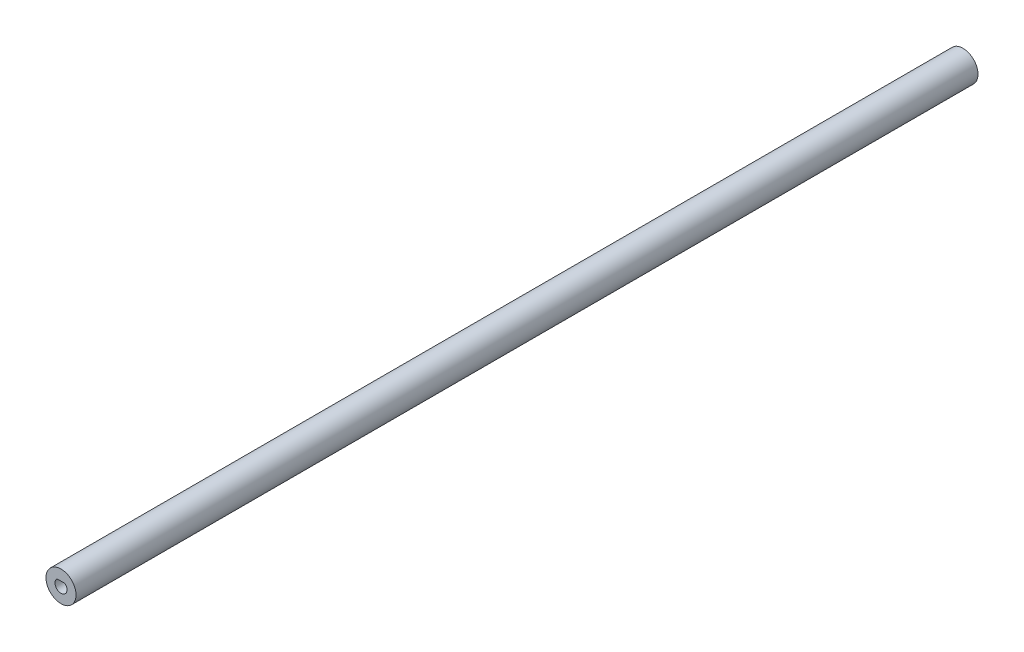
ISO-10303-21;
HEADER;
FILE_DESCRIPTION(('STEP AP214'),'2;1');
FILE_NAME('part.step','',(''),(''),'','','');
FILE_SCHEMA(('AUTOMOTIVE_DESIGN { 1 0 10303 214 1 1 1 1 }'));
ENDSEC;
DATA;
#1=APPLICATION_CONTEXT('core data for automotive mechanical design processes');
#2=APPLICATION_PROTOCOL_DEFINITION('international standard','automotive_design',2000,#1);
#3=PRODUCT_CONTEXT('',#1,'mechanical');
#4=PRODUCT('Part','Part','',(#3));
#5=PRODUCT_RELATED_PRODUCT_CATEGORY('part','',(#4));
#6=PRODUCT_DEFINITION_FORMATION('','',#4);
#7=PRODUCT_DEFINITION_CONTEXT('part definition',#1,'design');
#8=PRODUCT_DEFINITION('design','',#6,#7);
#9=PRODUCT_DEFINITION_SHAPE('','',#8);
#10=(LENGTH_UNIT() NAMED_UNIT(*) SI_UNIT(.MILLI.,.METRE.));
#11=(NAMED_UNIT(*) PLANE_ANGLE_UNIT() SI_UNIT($,.RADIAN.));
#12=(NAMED_UNIT(*) SI_UNIT($,.STERADIAN.) SOLID_ANGLE_UNIT());
#13=UNCERTAINTY_MEASURE_WITH_UNIT(LENGTH_MEASURE(1.E-05),#10,'distance_accuracy_value','');
#14=(GEOMETRIC_REPRESENTATION_CONTEXT(3) GLOBAL_UNCERTAINTY_ASSIGNED_CONTEXT((#13)) GLOBAL_UNIT_ASSIGNED_CONTEXT((#10,
#11,#12)) REPRESENTATION_CONTEXT('',''));
#15=CARTESIAN_POINT('',(0.,0.,0.));
#16=DIRECTION('',(0.,0.,1.));
#17=DIRECTION('',(1.,0.,0.));
#18=AXIS2_PLACEMENT_3D('',#15,#16,#17);
#19=CARTESIAN_POINT('',(-21.928145629141,1.41202452717339,300.));
#20=DIRECTION('',(0.,0.,-1.));
#21=DIRECTION('',(-1.,0.,0.));
#22=AXIS2_PLACEMENT_3D('',#19,#20,#21);
#23=CYLINDRICAL_SURFACE('',#22,5.);
#24=CARTESIAN_POINT('',(-21.928145629141,1.41202452717339,300.));
#25=DIRECTION('',(0.,0.,1.));
#26=DIRECTION('',(1.,0.,0.));
#27=AXIS2_PLACEMENT_3D('',#24,#25,#26);
#28=CIRCLE('',#27,5.);
#29=CARTESIAN_POINT('',(-16.928145629141,1.41202452717339,300.));
#30=VERTEX_POINT('',#29);
#31=EDGE_CURVE('E11',#30,#30,#28,.T.);
#32=ORIENTED_EDGE('',*,*,#31,.F.);
#33=EDGE_LOOP('',(#32));
#34=FACE_BOUND('',#33,.T.);
#35=CARTESIAN_POINT('',(-21.928145629141,1.41202452717339,0.));
#36=DIRECTION('',(0.,0.,1.));
#37=DIRECTION('',(1.,0.,0.));
#38=AXIS2_PLACEMENT_3D('',#35,#36,#37);
#39=CIRCLE('',#38,5.);
#40=CARTESIAN_POINT('',(-16.928145629141,1.41202452717339,0.));
#41=VERTEX_POINT('',#40);
#42=EDGE_CURVE('E41',#41,#41,#39,.T.);
#43=ORIENTED_EDGE('',*,*,#42,.T.);
#44=EDGE_LOOP('',(#43));
#45=FACE_BOUND('',#44,.T.);
#46=ADVANCED_FACE('F38',(#34,#45),#23,.T.);
#47=CARTESIAN_POINT('',(-21.928145629141,1.41202452717339,300.));
#48=DIRECTION('',(0.,0.,1.));
#49=DIRECTION('',(1.,0.,0.));
#50=AXIS2_PLACEMENT_3D('',#47,#48,#49);
#51=PLANE('',#50);
#52=CARTESIAN_POINT('',(-21.928145629141,1.41202452717339,300.));
#53=DIRECTION('',(0.,0.,1.));
#54=DIRECTION('',(1.,0.,0.));
#55=AXIS2_PLACEMENT_3D('',#52,#53,#54);
#56=CIRCLE('',#55,2.);
#57=CARTESIAN_POINT('',(-23.2510212846733,2.91202452717339,300.));
#58=VERTEX_POINT('',#57);
#59=CARTESIAN_POINT('',(-20.6052699736087,2.91202452717339,300.));
#60=VERTEX_POINT('',#59);
#61=EDGE_CURVE('E53',#58,#60,#56,.T.);
#62=ORIENTED_EDGE('',*,*,#61,.F.);
#63=DIRECTION('',(-1.,0.,0.));
#64=VECTOR('',#63,1.);
#65=CARTESIAN_POINT('',(-23.2510212846733,2.91202452717339,300.));
#66=LINE('',#65,#64);
#67=EDGE_CURVE('E73',#60,#58,#66,.T.);
#68=ORIENTED_EDGE('',*,*,#67,.F.);
#69=EDGE_LOOP('',(#62,#68));
#70=FACE_BOUND('',#69,.T.);
#71=ORIENTED_EDGE('',*,*,#31,.T.);
#72=EDGE_LOOP('',(#71));
#73=FACE_BOUND('',#72,.T.);
#74=ADVANCED_FACE('F78',(#70,#73),#51,.T.);
#75=CARTESIAN_POINT('',(-21.928145629141,1.41202452717339,0.));
#76=DIRECTION('',(0.,0.,1.));
#77=DIRECTION('',(1.,0.,0.));
#78=AXIS2_PLACEMENT_3D('',#75,#76,#77);
#79=PLANE('',#78);
#80=ORIENTED_EDGE('',*,*,#42,.F.);
#81=EDGE_LOOP('',(#80));
#82=FACE_BOUND('',#81,.T.);
#83=ADVANCED_FACE('F102',(#82),#79,.F.);
#84=CARTESIAN_POINT('',(-21.928145629141,1.41202452717339,292.));
#85=DIRECTION('',(0.,0.,1.));
#86=DIRECTION('',(1.,0.,0.));
#87=AXIS2_PLACEMENT_3D('',#84,#85,#86);
#88=CYLINDRICAL_SURFACE('',#87,2.);
#89=ORIENTED_EDGE('',*,*,#61,.T.);
#90=DIRECTION('',(0.,0.,1.));
#91=VECTOR('',#90,1.);
#92=CARTESIAN_POINT('',(-20.6052699736087,2.91202452717339,292.));
#93=LINE('',#92,#91);
#94=CARTESIAN_POINT('',(-20.6052699736087,2.91202452717339,292.));
#95=VERTEX_POINT('',#94);
#96=EDGE_CURVE('E70',#95,#60,#93,.T.);
#97=ORIENTED_EDGE('',*,*,#96,.F.);
#98=CARTESIAN_POINT('',(-21.928145629141,1.41202452717339,292.));
#99=DIRECTION('',(0.,0.,1.));
#100=DIRECTION('',(1.,0.,0.));
#101=AXIS2_PLACEMENT_3D('',#98,#99,#100);
#102=CIRCLE('',#101,2.);
#103=CARTESIAN_POINT('',(-23.2510212846733,2.91202452717339,292.));
#104=VERTEX_POINT('',#103);
#105=EDGE_CURVE('E67',#104,#95,#102,.T.);
#106=ORIENTED_EDGE('',*,*,#105,.F.);
#107=DIRECTION('',(0.,0.,1.));
#108=VECTOR('',#107,1.);
#109=CARTESIAN_POINT('',(-23.2510212846733,2.91202452717339,292.));
#110=LINE('',#109,#108);
#111=EDGE_CURVE('E61',#104,#58,#110,.T.);
#112=ORIENTED_EDGE('',*,*,#111,.T.);
#113=EDGE_LOOP('',(#89,#97,#106,#112));
#114=FACE_BOUND('',#113,.T.);
#115=ADVANCED_FACE('F65',(#114),#88,.F.);
#116=CARTESIAN_POINT('',(-23.2510212846733,2.91202452717339,292.));
#117=DIRECTION('',(0.,1.,0.));
#118=DIRECTION('',(0.,0.,1.));
#119=AXIS2_PLACEMENT_3D('',#116,#117,#118);
#120=PLANE('',#119);
#121=ORIENTED_EDGE('',*,*,#67,.T.);
#122=ORIENTED_EDGE('',*,*,#111,.F.);
#123=DIRECTION('',(-1.,0.,0.));
#124=VECTOR('',#123,1.);
#125=CARTESIAN_POINT('',(-23.2510212846733,2.91202452717339,292.));
#126=LINE('',#125,#124);
#127=EDGE_CURVE('E83',#95,#104,#126,.T.);
#128=ORIENTED_EDGE('',*,*,#127,.F.);
#129=ORIENTED_EDGE('',*,*,#96,.T.);
#130=EDGE_LOOP('',(#121,#122,#128,#129));
#131=FACE_BOUND('',#130,.T.);
#132=ADVANCED_FACE('F74',(#131),#120,.F.);
#133=CARTESIAN_POINT('',(-21.928145629141,1.41202452717339,292.));
#134=DIRECTION('',(0.,0.,1.));
#135=DIRECTION('',(1.,0.,0.));
#136=AXIS2_PLACEMENT_3D('',#133,#134,#135);
#137=PLANE('',#136);
#138=ORIENTED_EDGE('',*,*,#105,.T.);
#139=ORIENTED_EDGE('',*,*,#127,.T.);
#140=EDGE_LOOP('',(#138,#139));
#141=FACE_BOUND('',#140,.T.);
#142=ADVANCED_FACE('F90',(#141),#137,.T.);
#143=CLOSED_SHELL('',(#46,#74,#83,#115,#132,#142));
#144=MANIFOLD_SOLID_BREP('B2',#143);
#145=ADVANCED_BREP_SHAPE_REPRESENTATION('',(#18,#144),#14);
#146=SHAPE_DEFINITION_REPRESENTATION(#9,#145);
ENDSEC;
END-ISO-10303-21;
